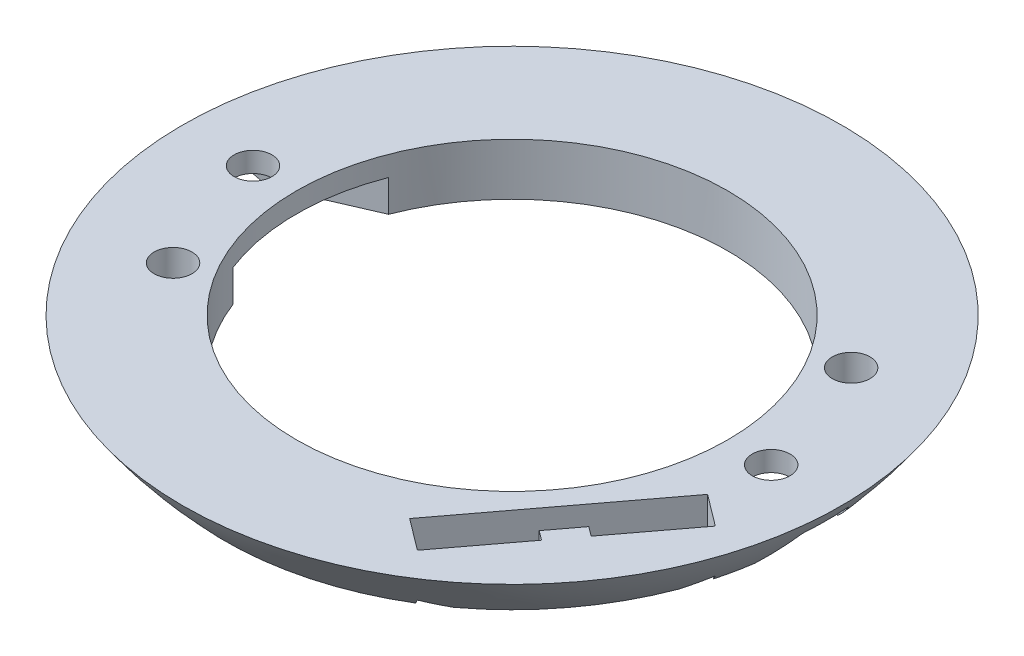
ISO-10303-21;
HEADER;
FILE_DESCRIPTION(('STEP AP214'),'2;1');
FILE_NAME('part.step','',(''),(''),'','','');
FILE_SCHEMA(('AUTOMOTIVE_DESIGN { 1 0 10303 214 1 1 1 1 }'));
ENDSEC;
DATA;
#1=APPLICATION_CONTEXT('core data for automotive mechanical design processes');
#2=APPLICATION_PROTOCOL_DEFINITION('international standard','automotive_design',2000,#1);
#3=PRODUCT_CONTEXT('',#1,'mechanical');
#4=PRODUCT('Part','Part','',(#3));
#5=PRODUCT_RELATED_PRODUCT_CATEGORY('part','',(#4));
#6=PRODUCT_DEFINITION_FORMATION('','',#4);
#7=PRODUCT_DEFINITION_CONTEXT('part definition',#1,'design');
#8=PRODUCT_DEFINITION('design','',#6,#7);
#9=PRODUCT_DEFINITION_SHAPE('','',#8);
#10=(LENGTH_UNIT() NAMED_UNIT(*) SI_UNIT(.MILLI.,.METRE.));
#11=(NAMED_UNIT(*) PLANE_ANGLE_UNIT() SI_UNIT($,.RADIAN.));
#12=(NAMED_UNIT(*) SI_UNIT($,.STERADIAN.) SOLID_ANGLE_UNIT());
#13=UNCERTAINTY_MEASURE_WITH_UNIT(LENGTH_MEASURE(1.E-05),#10,'distance_accuracy_value','');
#14=(GEOMETRIC_REPRESENTATION_CONTEXT(3) GLOBAL_UNCERTAINTY_ASSIGNED_CONTEXT((#13)) GLOBAL_UNIT_ASSIGNED_CONTEXT((#10,
#11,#12)) REPRESENTATION_CONTEXT('',''));
#15=CARTESIAN_POINT('',(0.,0.,0.));
#16=DIRECTION('',(0.,0.,1.));
#17=DIRECTION('',(1.,0.,0.));
#18=AXIS2_PLACEMENT_3D('',#15,#16,#17);
#19=CARTESIAN_POINT('',(0.,0.,0.));
#20=DIRECTION('',(0.,-1.,0.));
#21=DIRECTION('',(-1.,0.,0.));
#22=AXIS2_PLACEMENT_3D('',#19,#20,#21);
#23=SPHERICAL_SURFACE('',#22,33.8);
#24=CARTESIAN_POINT('',(0.,-19.1,0.));
#25=DIRECTION('',(0.,1.,0.));
#26=DIRECTION('',(0.,0.,1.));
#27=AXIS2_PLACEMENT_3D('',#24,#25,#26);
#28=CIRCLE('',#27,27.8860180018589);
#29=CARTESIAN_POINT('',(0.,-19.1,27.8860180018589));
#30=VERTEX_POINT('',#29);
#31=EDGE_CURVE('E258',#30,#30,#28,.F.);
#32=ORIENTED_EDGE('',*,*,#31,.T.);
#33=EDGE_LOOP('',(#32));
#34=FACE_BOUND('',#33,.T.);
#35=CARTESIAN_POINT('',(0.,-23.5,0.));
#36=DIRECTION('',(0.,1.,0.));
#37=DIRECTION('',(-1.,0.,0.));
#38=AXIS2_PLACEMENT_3D('',#35,#36,#37);
#39=CIRCLE('',#38,24.2938263762627);
#40=CARTESIAN_POINT('',(23.4377361695653,-23.5,6.39238009241078));
#41=VERTEX_POINT('',#40);
#42=CARTESIAN_POINT('',(24.0425991799101,-23.5,3.48474169404068));
#43=VERTEX_POINT('',#42);
#44=EDGE_CURVE('E58',#41,#43,#39,.T.);
#45=ORIENTED_EDGE('',*,*,#44,.T.);
#46=CARTESIAN_POINT('',(7.7770088427528,0.,13.1236491606903));
#47=DIRECTION('',(-0.509803921568628,0.,-0.860290626214913));
#48=DIRECTION('',(-0.860290626214914,0.,0.509803921568628));
#49=AXIS2_PLACEMENT_3D('',#46,#47,#48);
#50=CIRCLE('',#49,30.1616970040954);
#51=CARTESIAN_POINT('',(26.5677721433111,-20.8,1.98833682787942));
#52=VERTEX_POINT('',#51);
#53=EDGE_CURVE('E214',#52,#43,#50,.T.);
#54=ORIENTED_EDGE('',*,*,#53,.F.);
#55=CARTESIAN_POINT('',(0.,-20.8,0.));
#56=DIRECTION('',(0.,1.,0.));
#57=DIRECTION('',(0.,0.,1.));
#58=AXIS2_PLACEMENT_3D('',#55,#56,#57);
#59=CIRCLE('',#58,26.6420719914949);
#60=CARTESIAN_POINT('',(26.5677721433111,-20.8,-1.98833682787944));
#61=VERTEX_POINT('',#60);
#62=EDGE_CURVE('E498',#52,#61,#59,.T.);
#63=ORIENTED_EDGE('',*,*,#62,.T.);
#64=CARTESIAN_POINT('',(7.77700884275279,0.,-13.1236491606903));
#65=DIRECTION('',(-0.509803921568628,0.,0.860290626214914));
#66=DIRECTION('',(0.860290626214914,0.,0.509803921568628));
#67=AXIS2_PLACEMENT_3D('',#64,#65,#66);
#68=CIRCLE('',#67,30.1616970040954);
#69=CARTESIAN_POINT('',(24.0425991799101,-23.5,-3.48474169404069));
#70=VERTEX_POINT('',#69);
#71=EDGE_CURVE('E479',#70,#61,#68,.T.);
#72=ORIENTED_EDGE('',*,*,#71,.F.);
#73=CARTESIAN_POINT('',(-24.0425991799101,-23.5,-3.48474169404067));
#74=VERTEX_POINT('',#73);
#75=EDGE_CURVE('E366',#70,#74,#39,.T.);
#76=ORIENTED_EDGE('',*,*,#75,.T.);
#77=CARTESIAN_POINT('',(-7.77700884275279,0.,-13.1236491606903));
#78=DIRECTION('',(0.509803921568628,0.,0.860290626214914));
#79=DIRECTION('',(0.860290626214914,0.,-0.509803921568628));
#80=AXIS2_PLACEMENT_3D('',#77,#78,#79);
#81=CIRCLE('',#80,30.1616970040954);
#82=CARTESIAN_POINT('',(-26.5677721433111,-20.8,-1.98833682787942));
#83=VERTEX_POINT('',#82);
#84=EDGE_CURVE('E50',#83,#74,#81,.T.);
#85=ORIENTED_EDGE('',*,*,#84,.F.);
#86=CARTESIAN_POINT('',(0.,-20.8,0.));
#87=DIRECTION('',(0.,-1.,0.));
#88=DIRECTION('',(0.,0.,-1.));
#89=AXIS2_PLACEMENT_3D('',#86,#87,#88);
#90=CIRCLE('',#89,26.642071991495);
#91=CARTESIAN_POINT('',(-26.5677721433111,-20.8,1.98833682787941));
#92=VERTEX_POINT('',#91);
#93=EDGE_CURVE('E493',#92,#83,#90,.T.);
#94=ORIENTED_EDGE('',*,*,#93,.F.);
#95=CARTESIAN_POINT('',(-7.77700884275278,0.,13.1236491606902));
#96=DIRECTION('',(0.509803921568627,0.,-0.860290626214914));
#97=DIRECTION('',(-0.860290626214914,0.,-0.509803921568627));
#98=AXIS2_PLACEMENT_3D('',#95,#96,#97);
#99=CIRCLE('',#98,30.1616970040954);
#100=CARTESIAN_POINT('',(-24.0425991799101,-23.5,3.48474169404067));
#101=VERTEX_POINT('',#100);
#102=EDGE_CURVE('E480',#101,#92,#99,.T.);
#103=ORIENTED_EDGE('',*,*,#102,.F.);
#104=CARTESIAN_POINT('',(12.6050657528284,-23.5,20.767819273262));
#105=VERTEX_POINT('',#104);
#106=EDGE_CURVE('E368',#101,#105,#39,.T.);
#107=ORIENTED_EDGE('',*,*,#106,.T.);
#108=CARTESIAN_POINT('',(-5.41633520836847,0.,7.18771959042562));
#109=DIRECTION('',(0.601815023152052,0.,-0.79863551004729));
#110=DIRECTION('',(-0.79863551004729,0.,-0.601815023152052));
#111=AXIS2_PLACEMENT_3D('',#108,#109,#110);
#112=CIRCLE('',#111,32.5797483108756);
#113=CARTESIAN_POINT('',(13.2104646358181,-22.7478481812202,21.2240200534666));
#114=VERTEX_POINT('',#113);
#115=EDGE_CURVE('E395',#114,#105,#112,.T.);
#116=ORIENTED_EDGE('',*,*,#115,.F.);
#117=CARTESIAN_POINT('',(18.6267998441866,0.,14.036300463041));
#118=DIRECTION('',(0.79863551004729,0.,0.601815023152052));
#119=DIRECTION('',(0.601815023152052,0.,-0.79863551004729));
#120=AXIS2_PLACEMENT_3D('',#117,#118,#119);
#121=CIRCLE('',#120,24.4635360664775);
#122=CARTESIAN_POINT('',(14.5355819574909,-23.5,19.4655299737013));
#123=VERTEX_POINT('',#122);
#124=EDGE_CURVE('E397',#114,#123,#121,.T.);
#125=ORIENTED_EDGE('',*,*,#124,.T.);
#126=CARTESIAN_POINT('',(0.,-23.5,0.));
#127=DIRECTION('',(0.,1.,0.));
#128=DIRECTION('',(-1.,0.,0.));
#129=AXIS2_PLACEMENT_3D('',#126,#127,#128);
#130=CIRCLE('',#129,24.2938263762627);
#131=CARTESIAN_POINT('',(22.7180177308823,-23.5,8.60707095238078));
#132=VERTEX_POINT('',#131);
#133=EDGE_CURVE('E468',#123,#132,#130,.T.);
#134=ORIENTED_EDGE('',*,*,#133,.T.);
#135=CARTESIAN_POINT('',(18.6267998441866,0.,14.036300463041));
#136=DIRECTION('',(0.79863551004729,0.,0.601815023152052));
#137=DIRECTION('',(0.601815023152052,0.,-0.79863551004729));
#138=AXIS2_PLACEMENT_3D('',#135,#136,#137);
#139=CIRCLE('',#138,24.4635360664775);
#140=CARTESIAN_POINT('',(24.0431350525551,-22.7478481812202,6.84858087261544));
#141=VERTEX_POINT('',#140);
#142=EDGE_CURVE('E391',#132,#141,#139,.T.);
#143=ORIENTED_EDGE('',*,*,#142,.T.);
#144=CARTESIAN_POINT('',(5.4163352083685,0.,-7.18771959042563));
#145=DIRECTION('',(0.601815023152053,0.,-0.798635510047289));
#146=DIRECTION('',(-0.798635510047289,0.,-0.601815023152053));
#147=AXIS2_PLACEMENT_3D('',#144,#145,#146);
#148=CIRCLE('',#147,32.5797483108756);
#149=EDGE_CURVE('E364',#141,#41,#148,.T.);
#150=ORIENTED_EDGE('',*,*,#149,.T.);
#151=EDGE_LOOP('',(#45,#54,#63,#72,#76,#85,#94,#103,#107,#116,#125,#134,#143,#150));
#152=FACE_BOUND('',#151,.T.);
#153=ADVANCED_FACE('F36',(#34,#152),#23,.T.);
#154=CARTESIAN_POINT('',(0.,-23.5,0.));
#155=DIRECTION('',(0.,1.,0.));
#156=DIRECTION('',(-1.,0.,0.));
#157=AXIS2_PLACEMENT_3D('',#154,#155,#156);
#158=PLANE('',#157);
#159=CARTESIAN_POINT('',(-18.1865334794732,-23.5,10.5));
#160=DIRECTION('',(0.,1.,0.));
#161=DIRECTION('',(-1.,0.,0.));
#162=AXIS2_PLACEMENT_3D('',#159,#160,#161);
#163=CIRCLE('',#162,1.6);
#164=CARTESIAN_POINT('',(-19.7865334794732,-23.5,10.5));
#165=VERTEX_POINT('',#164);
#166=EDGE_CURVE('E458',#165,#165,#163,.T.);
#167=ORIENTED_EDGE('',*,*,#166,.T.);
#168=EDGE_LOOP('',(#167));
#169=FACE_BOUND('',#168,.T.);
#170=DIRECTION('',(0.860290626214914,0.,-0.509803921568628));
#171=VECTOR('',#170,1.);
#172=CARTESIAN_POINT('',(29.9230769230769,-23.5,0.));
#173=LINE('',#172,#171);
#174=CARTESIAN_POINT('',(24.,-23.5,3.50998575495684));
#175=VERTEX_POINT('',#174);
#176=EDGE_CURVE('E206',#175,#43,#173,.T.);
#177=ORIENTED_EDGE('',*,*,#176,.T.);
#178=ORIENTED_EDGE('',*,*,#44,.F.);
#179=DIRECTION('',(-0.798635510047289,0.,-0.601815023152053));
#180=VECTOR('',#179,1.);
#181=CARTESIAN_POINT('',(5.41633520836849,-23.5,-7.18771959042564));
#182=LINE('',#181,#180);
#183=CARTESIAN_POINT('',(21.3890454093143,-23.5,4.84858087261543));
#184=VERTEX_POINT('',#183);
#185=EDGE_CURVE('E387',#41,#184,#182,.T.);
#186=ORIENTED_EDGE('',*,*,#185,.T.);
#187=DIRECTION('',(0.601815023152052,0.,-0.79863551004729));
#188=VECTOR('',#187,1.);
#189=CARTESIAN_POINT('',(15.9727102009458,-23.5,12.0363004630411));
#190=LINE('',#189,#188);
#191=CARTESIAN_POINT('',(10.5563749925773,-23.5,19.2240200534667));
#192=VERTEX_POINT('',#191);
#193=EDGE_CURVE('E381',#192,#184,#190,.T.);
#194=ORIENTED_EDGE('',*,*,#193,.F.);
#195=DIRECTION('',(-0.79863551004729,0.,-0.601815023152052));
#196=VECTOR('',#195,1.);
#197=CARTESIAN_POINT('',(-5.41633520836848,-23.5,7.18771959042561));
#198=LINE('',#197,#196);
#199=EDGE_CURVE('E375',#105,#192,#198,.T.);
#200=ORIENTED_EDGE('',*,*,#199,.F.);
#201=ORIENTED_EDGE('',*,*,#106,.F.);
#202=DIRECTION('',(0.860290626214914,0.,0.509803921568627));
#203=VECTOR('',#202,1.);
#204=CARTESIAN_POINT('',(-29.9230769230769,-23.5,0.));
#205=LINE('',#204,#203);
#206=CARTESIAN_POINT('',(-24.,-23.5,3.50998575495685));
#207=VERTEX_POINT('',#206);
#208=EDGE_CURVE('E485',#101,#207,#205,.T.);
#209=ORIENTED_EDGE('',*,*,#208,.T.);
#210=CARTESIAN_POINT('',(-21.92,-23.5,0.));
#211=DIRECTION('',(0.,-1.,0.));
#212=DIRECTION('',(1.,0.,0.));
#213=AXIS2_PLACEMENT_3D('',#210,#211,#212);
#214=CIRCLE('',#213,4.08);
#215=CARTESIAN_POINT('',(-23.5442836718279,-23.5,3.74273997940457));
#216=VERTEX_POINT('',#215);
#217=EDGE_CURVE('E289',#207,#216,#214,.F.);
#218=ORIENTED_EDGE('',*,*,#217,.T.);
#219=DIRECTION('',(0.917338230246221,0.,0.398108743095064));
#220=VECTOR('',#219,1.);
#221=CARTESIAN_POINT('',(-5.09839699535364,-23.5,11.7479320862179));
#222=LINE('',#221,#220);
#223=CARTESIAN_POINT('',(-17.0257322293628,-23.5,6.57167726338076));
#224=VERTEX_POINT('',#223);
#225=EDGE_CURVE('E225',#216,#224,#222,.T.);
#226=ORIENTED_EDGE('',*,*,#225,.T.);
#227=CARTESIAN_POINT('',(0.,-23.5,0.));
#228=DIRECTION('',(0.,-1.,0.));
#229=DIRECTION('',(1.,0.,0.));
#230=AXIS2_PLACEMENT_3D('',#227,#228,#229);
#231=CIRCLE('',#230,18.25);
#232=CARTESIAN_POINT('',(17.0257322293628,-23.5,6.57167726338076));
#233=VERTEX_POINT('',#232);
#234=EDGE_CURVE('E39',#224,#233,#231,.F.);
#235=ORIENTED_EDGE('',*,*,#234,.T.);
#236=DIRECTION('',(-0.917338230246221,0.,0.398108743095064));
#237=VECTOR('',#236,1.);
#238=CARTESIAN_POINT('',(5.09839699535366,-23.5,11.7479320862179));
#239=LINE('',#238,#237);
#240=CARTESIAN_POINT('',(23.5442836718279,-23.5,3.74273997940458));
#241=VERTEX_POINT('',#240);
#242=EDGE_CURVE('E221',#241,#233,#239,.T.);
#243=ORIENTED_EDGE('',*,*,#242,.F.);
#244=CARTESIAN_POINT('',(21.92,-23.5,0.));
#245=DIRECTION('',(0.,-1.,0.));
#246=DIRECTION('',(1.,0.,0.));
#247=AXIS2_PLACEMENT_3D('',#244,#245,#246);
#248=CIRCLE('',#247,4.08);
#249=EDGE_CURVE('E218',#241,#175,#248,.F.);
#250=ORIENTED_EDGE('',*,*,#249,.T.);
#251=EDGE_LOOP('',(#177,#178,#186,#194,#200,#201,#209,#218,#226,#235,#243,#250));
#252=FACE_BOUND('',#251,.T.);
#253=ADVANCED_FACE('F219',(#169,#252),#158,.F.);
#254=CARTESIAN_POINT('',(18.1865334794732,-23.5,-10.5));
#255=DIRECTION('',(0.,1.,0.));
#256=DIRECTION('',(-1.,0.,0.));
#257=AXIS2_PLACEMENT_3D('',#254,#255,#256);
#258=CIRCLE('',#257,1.6);
#259=CARTESIAN_POINT('',(16.5865334794732,-23.5,-10.5));
#260=VERTEX_POINT('',#259);
#261=EDGE_CURVE('E456',#260,#260,#258,.T.);
#262=ORIENTED_EDGE('',*,*,#261,.T.);
#263=EDGE_LOOP('',(#262));
#264=FACE_BOUND('',#263,.T.);
#265=DIRECTION('',(-0.860290626214914,0.,-0.509803921568628));
#266=VECTOR('',#265,1.);
#267=CARTESIAN_POINT('',(24.,-23.5,-3.50998575495685));
#268=LINE('',#267,#266);
#269=CARTESIAN_POINT('',(24.,-23.5,-3.50998575495685));
#270=VERTEX_POINT('',#269);
#271=EDGE_CURVE('E477',#70,#270,#268,.T.);
#272=ORIENTED_EDGE('',*,*,#271,.T.);
#273=CARTESIAN_POINT('',(21.92,-23.5,0.));
#274=DIRECTION('',(0.,-1.,0.));
#275=DIRECTION('',(1.,0.,0.));
#276=AXIS2_PLACEMENT_3D('',#273,#274,#275);
#277=CIRCLE('',#276,4.08);
#278=CARTESIAN_POINT('',(23.5442836718279,-23.5,-3.74273997940459));
#279=VERTEX_POINT('',#278);
#280=EDGE_CURVE('E224',#270,#279,#277,.F.);
#281=ORIENTED_EDGE('',*,*,#280,.T.);
#282=DIRECTION('',(0.917338230246221,0.,0.398108743095064));
#283=VECTOR('',#282,1.);
#284=CARTESIAN_POINT('',(5.09839699535366,-23.5,-11.7479320862179));
#285=LINE('',#284,#283);
#286=CARTESIAN_POINT('',(17.0257322293628,-23.5,-6.57167726338077));
#287=VERTEX_POINT('',#286);
#288=EDGE_CURVE('E286',#287,#279,#285,.T.);
#289=ORIENTED_EDGE('',*,*,#288,.F.);
#290=CARTESIAN_POINT('',(-17.0257322293628,-23.5,-6.57167726338077));
#291=VERTEX_POINT('',#290);
#292=EDGE_CURVE('E11',#287,#291,#231,.F.);
#293=ORIENTED_EDGE('',*,*,#292,.T.);
#294=DIRECTION('',(0.917338230246221,0.,-0.398108743095064));
#295=VECTOR('',#294,1.);
#296=CARTESIAN_POINT('',(-5.09839699535364,-23.5,-11.7479320862179));
#297=LINE('',#296,#295);
#298=CARTESIAN_POINT('',(-23.5442836718279,-23.5,-3.74273997940457));
#299=VERTEX_POINT('',#298);
#300=EDGE_CURVE('E291',#299,#291,#297,.T.);
#301=ORIENTED_EDGE('',*,*,#300,.F.);
#302=CARTESIAN_POINT('',(-21.92,-23.5,0.));
#303=DIRECTION('',(0.,-1.,0.));
#304=DIRECTION('',(1.,0.,0.));
#305=AXIS2_PLACEMENT_3D('',#302,#303,#304);
#306=CIRCLE('',#305,4.08);
#307=CARTESIAN_POINT('',(-24.,-23.5,-3.50998575495685));
#308=VERTEX_POINT('',#307);
#309=EDGE_CURVE('E294',#299,#308,#306,.F.);
#310=ORIENTED_EDGE('',*,*,#309,.T.);
#311=DIRECTION('',(-0.860290626214914,0.,0.509803921568628));
#312=VECTOR('',#311,1.);
#313=CARTESIAN_POINT('',(-24.,-23.5,-3.50998575495685));
#314=LINE('',#313,#312);
#315=EDGE_CURVE('E483',#308,#74,#314,.T.);
#316=ORIENTED_EDGE('',*,*,#315,.T.);
#317=ORIENTED_EDGE('',*,*,#75,.F.);
#318=EDGE_LOOP('',(#272,#281,#289,#293,#301,#310,#316,#317));
#319=FACE_BOUND('',#318,.T.);
#320=ADVANCED_FACE('F357',(#264,#319),#158,.F.);
#321=CARTESIAN_POINT('',(-5.09839699535365,-33.801,11.7479320862179));
#322=DIRECTION('',(-0.398108743095063,0.,0.917338230246221));
#323=DIRECTION('',(0.917338230246221,0.,0.398108743095064));
#324=AXIS2_PLACEMENT_3D('',#321,#322,#323);
#325=PLANE('',#324);
#326=ORIENTED_EDGE('',*,*,#225,.F.);
#327=DIRECTION('',(0.,1.,0.));
#328=VECTOR('',#327,1.);
#329=CARTESIAN_POINT('',(-23.5442836718279,-33.801,3.74273997940457));
#330=LINE('',#329,#328);
#331=CARTESIAN_POINT('',(-23.5442836718279,-20.8,3.74273997940457));
#332=VERTEX_POINT('',#331);
#333=EDGE_CURVE('E253',#216,#332,#330,.T.);
#334=ORIENTED_EDGE('',*,*,#333,.T.);
#335=DIRECTION('',(0.917338230246221,0.,0.398108743095064));
#336=VECTOR('',#335,1.);
#337=CARTESIAN_POINT('',(-23.5442836718279,-20.8,3.74273997940457));
#338=LINE('',#337,#336);
#339=CARTESIAN_POINT('',(-17.0257322293628,-20.8,6.57167726338076));
#340=VERTEX_POINT('',#339);
#341=EDGE_CURVE('E305',#332,#340,#338,.T.);
#342=ORIENTED_EDGE('',*,*,#341,.T.);
#343=DIRECTION('',(0.,1.,0.));
#344=VECTOR('',#343,1.);
#345=CARTESIAN_POINT('',(-17.0257322293628,-33.801,6.57167726338076));
#346=LINE('',#345,#344);
#347=EDGE_CURVE('E255',#224,#340,#346,.T.);
#348=ORIENTED_EDGE('',*,*,#347,.F.);
#349=EDGE_LOOP('',(#326,#334,#342,#348));
#350=FACE_BOUND('',#349,.T.);
#351=ADVANCED_FACE('F530',(#350),#325,.F.);
#352=CARTESIAN_POINT('',(-21.92,-33.801,0.));
#353=DIRECTION('',(0.,1.,0.));
#354=DIRECTION('',(0.,0.,1.));
#355=AXIS2_PLACEMENT_3D('',#352,#353,#354);
#356=CYLINDRICAL_SURFACE('',#355,4.08);
#357=ORIENTED_EDGE('',*,*,#217,.F.);
#358=DIRECTION('',(0.,1.,0.));
#359=VECTOR('',#358,1.);
#360=CARTESIAN_POINT('',(-24.,-33.801,3.50998575495685));
#361=LINE('',#360,#359);
#362=CARTESIAN_POINT('',(-24.,-20.8,3.50998575495685));
#363=VERTEX_POINT('',#362);
#364=EDGE_CURVE('E250',#207,#363,#361,.T.);
#365=ORIENTED_EDGE('',*,*,#364,.T.);
#366=CARTESIAN_POINT('',(-21.92,-20.8,0.));
#367=DIRECTION('',(0.,1.,0.));
#368=DIRECTION('',(0.,0.,1.));
#369=AXIS2_PLACEMENT_3D('',#366,#367,#368);
#370=CIRCLE('',#369,4.08);
#371=EDGE_CURVE('E312',#363,#332,#370,.T.);
#372=ORIENTED_EDGE('',*,*,#371,.T.);
#373=ORIENTED_EDGE('',*,*,#333,.F.);
#374=EDGE_LOOP('',(#357,#365,#372,#373));
#375=FACE_BOUND('',#374,.T.);
#376=ADVANCED_FACE('F528',(#375),#356,.F.);
#377=CARTESIAN_POINT('',(-21.92,-33.801,0.));
#378=DIRECTION('',(0.,1.,0.));
#379=DIRECTION('',(0.,0.,1.));
#380=AXIS2_PLACEMENT_3D('',#377,#378,#379);
#381=CYLINDRICAL_SURFACE('',#380,4.08);
#382=ORIENTED_EDGE('',*,*,#309,.F.);
#383=DIRECTION('',(0.,1.,0.));
#384=VECTOR('',#383,1.);
#385=CARTESIAN_POINT('',(-23.5442836718279,-33.801,-3.74273997940457));
#386=LINE('',#385,#384);
#387=CARTESIAN_POINT('',(-23.5442836718279,-20.8,-3.74273997940457));
#388=VERTEX_POINT('',#387);
#389=EDGE_CURVE('E246',#299,#388,#386,.T.);
#390=ORIENTED_EDGE('',*,*,#389,.T.);
#391=CARTESIAN_POINT('',(-21.92,-20.8,0.));
#392=DIRECTION('',(0.,1.,0.));
#393=DIRECTION('',(0.,0.,1.));
#394=AXIS2_PLACEMENT_3D('',#391,#392,#393);
#395=CIRCLE('',#394,4.08);
#396=CARTESIAN_POINT('',(-24.,-20.8,-3.50998575495685));
#397=VERTEX_POINT('',#396);
#398=EDGE_CURVE('E315',#388,#397,#395,.T.);
#399=ORIENTED_EDGE('',*,*,#398,.T.);
#400=DIRECTION('',(0.,1.,0.));
#401=VECTOR('',#400,1.);
#402=CARTESIAN_POINT('',(-24.,-33.801,-3.50998575495685));
#403=LINE('',#402,#401);
#404=EDGE_CURVE('E248',#308,#397,#403,.T.);
#405=ORIENTED_EDGE('',*,*,#404,.F.);
#406=EDGE_LOOP('',(#382,#390,#399,#405));
#407=FACE_BOUND('',#406,.T.);
#408=ADVANCED_FACE('F540',(#407),#381,.F.);
#409=CARTESIAN_POINT('',(-5.09839699535365,-33.801,-11.7479320862179));
#410=DIRECTION('',(0.398108743095063,0.,0.917338230246221));
#411=DIRECTION('',(0.917338230246221,0.,-0.398108743095064));
#412=AXIS2_PLACEMENT_3D('',#409,#410,#411);
#413=PLANE('',#412);
#414=ORIENTED_EDGE('',*,*,#389,.F.);
#415=ORIENTED_EDGE('',*,*,#300,.T.);
#416=DIRECTION('',(0.,1.,0.));
#417=VECTOR('',#416,1.);
#418=CARTESIAN_POINT('',(-17.0257322293628,-33.801,-6.57167726338077));
#419=LINE('',#418,#417);
#420=CARTESIAN_POINT('',(-17.0257322293628,-20.8,-6.57167726338077));
#421=VERTEX_POINT('',#420);
#422=EDGE_CURVE('E244',#291,#421,#419,.T.);
#423=ORIENTED_EDGE('',*,*,#422,.T.);
#424=DIRECTION('',(-0.917338230246221,0.,0.398108743095064));
#425=VECTOR('',#424,1.);
#426=CARTESIAN_POINT('',(-23.5442836718279,-20.8,-3.74273997940457));
#427=LINE('',#426,#425);
#428=EDGE_CURVE('E318',#421,#388,#427,.T.);
#429=ORIENTED_EDGE('',*,*,#428,.T.);
#430=EDGE_LOOP('',(#414,#415,#423,#429));
#431=FACE_BOUND('',#430,.T.);
#432=ADVANCED_FACE('F536',(#431),#413,.T.);
#433=CARTESIAN_POINT('',(5.09839699535365,-33.801,11.7479320862179));
#434=DIRECTION('',(-0.398108743095064,0.,-0.917338230246221));
#435=DIRECTION('',(-0.917338230246221,0.,0.398108743095064));
#436=AXIS2_PLACEMENT_3D('',#433,#434,#435);
#437=PLANE('',#436);
#438=DIRECTION('',(0.,1.,0.));
#439=VECTOR('',#438,1.);
#440=CARTESIAN_POINT('',(23.5442836718279,-33.801,3.74273997940457));
#441=LINE('',#440,#439);
#442=CARTESIAN_POINT('',(23.5442836718279,-20.8,3.74273997940457));
#443=VERTEX_POINT('',#442);
#444=EDGE_CURVE('E232',#241,#443,#441,.T.);
#445=ORIENTED_EDGE('',*,*,#444,.F.);
#446=ORIENTED_EDGE('',*,*,#242,.T.);
#447=DIRECTION('',(0.,1.,0.));
#448=VECTOR('',#447,1.);
#449=CARTESIAN_POINT('',(17.0257322293628,-33.801,6.57167726338076));
#450=LINE('',#449,#448);
#451=CARTESIAN_POINT('',(17.0257322293628,-20.8,6.57167726338076));
#452=VERTEX_POINT('',#451);
#453=EDGE_CURVE('E257',#233,#452,#450,.T.);
#454=ORIENTED_EDGE('',*,*,#453,.T.);
#455=DIRECTION('',(0.917338230246221,0.,-0.398108743095064));
#456=VECTOR('',#455,1.);
#457=CARTESIAN_POINT('',(23.5442836718279,-20.8,3.74273997940457));
#458=LINE('',#457,#456);
#459=EDGE_CURVE('E325',#452,#443,#458,.T.);
#460=ORIENTED_EDGE('',*,*,#459,.T.);
#461=EDGE_LOOP('',(#445,#446,#454,#460));
#462=FACE_BOUND('',#461,.T.);
#463=ADVANCED_FACE('F275',(#462),#437,.T.);
#464=CARTESIAN_POINT('',(5.09839699535365,-33.801,-11.7479320862179));
#465=DIRECTION('',(-0.398108743095064,0.,0.917338230246221));
#466=DIRECTION('',(0.917338230246221,0.,0.398108743095064));
#467=AXIS2_PLACEMENT_3D('',#464,#465,#466);
#468=PLANE('',#467);
#469=DIRECTION('',(0.,1.,0.));
#470=VECTOR('',#469,1.);
#471=CARTESIAN_POINT('',(17.0257322293628,-33.801,-6.57167726338076));
#472=LINE('',#471,#470);
#473=CARTESIAN_POINT('',(17.0257322293628,-20.8,-6.57167726338076));
#474=VERTEX_POINT('',#473);
#475=EDGE_CURVE('E242',#287,#474,#472,.T.);
#476=ORIENTED_EDGE('',*,*,#475,.F.);
#477=ORIENTED_EDGE('',*,*,#288,.T.);
#478=DIRECTION('',(0.,1.,0.));
#479=VECTOR('',#478,1.);
#480=CARTESIAN_POINT('',(23.5442836718279,-33.801,-3.74273997940458));
#481=LINE('',#480,#479);
#482=CARTESIAN_POINT('',(23.5442836718279,-20.8,-3.74273997940458));
#483=VERTEX_POINT('',#482);
#484=EDGE_CURVE('E235',#279,#483,#481,.T.);
#485=ORIENTED_EDGE('',*,*,#484,.T.);
#486=DIRECTION('',(-0.917338230246221,0.,-0.398108743095062));
#487=VECTOR('',#486,1.);
#488=CARTESIAN_POINT('',(17.0257322293628,-20.8,-6.57167726338076));
#489=LINE('',#488,#487);
#490=EDGE_CURVE('E331',#483,#474,#489,.T.);
#491=ORIENTED_EDGE('',*,*,#490,.T.);
#492=EDGE_LOOP('',(#476,#477,#485,#491));
#493=FACE_BOUND('',#492,.T.);
#494=ADVANCED_FACE('F599',(#493),#468,.T.);
#495=CARTESIAN_POINT('',(21.92,-33.801,0.));
#496=DIRECTION('',(0.,1.,0.));
#497=DIRECTION('',(0.,0.,1.));
#498=AXIS2_PLACEMENT_3D('',#495,#496,#497);
#499=CYLINDRICAL_SURFACE('',#498,4.08);
#500=ORIENTED_EDGE('',*,*,#280,.F.);
#501=DIRECTION('',(0.,1.,0.));
#502=VECTOR('',#501,1.);
#503=CARTESIAN_POINT('',(24.,-33.801,-3.50998575495685));
#504=LINE('',#503,#502);
#505=CARTESIAN_POINT('',(24.,-20.8,-3.50998575495685));
#506=VERTEX_POINT('',#505);
#507=EDGE_CURVE('E231',#270,#506,#504,.T.);
#508=ORIENTED_EDGE('',*,*,#507,.T.);
#509=CARTESIAN_POINT('',(21.92,-20.8,0.));
#510=DIRECTION('',(0.,1.,0.));
#511=DIRECTION('',(0.,0.,1.));
#512=AXIS2_PLACEMENT_3D('',#509,#510,#511);
#513=CIRCLE('',#512,4.07999999999999);
#514=EDGE_CURVE('E328',#506,#483,#513,.T.);
#515=ORIENTED_EDGE('',*,*,#514,.T.);
#516=ORIENTED_EDGE('',*,*,#484,.F.);
#517=EDGE_LOOP('',(#500,#508,#515,#516));
#518=FACE_BOUND('',#517,.T.);
#519=ADVANCED_FACE('F515',(#518),#499,.F.);
#520=CARTESIAN_POINT('',(21.92,-33.801,0.));
#521=DIRECTION('',(0.,1.,0.));
#522=DIRECTION('',(0.,0.,1.));
#523=AXIS2_PLACEMENT_3D('',#520,#521,#522);
#524=CYLINDRICAL_SURFACE('',#523,4.08);
#525=ORIENTED_EDGE('',*,*,#249,.F.);
#526=ORIENTED_EDGE('',*,*,#444,.T.);
#527=CARTESIAN_POINT('',(21.92,-20.8,0.));
#528=DIRECTION('',(0.,1.,0.));
#529=DIRECTION('',(0.,0.,1.));
#530=AXIS2_PLACEMENT_3D('',#527,#528,#529);
#531=CIRCLE('',#530,4.08);
#532=CARTESIAN_POINT('',(24.,-20.8,3.50998575495684));
#533=VERTEX_POINT('',#532);
#534=EDGE_CURVE('E230',#443,#533,#531,.T.);
#535=ORIENTED_EDGE('',*,*,#534,.T.);
#536=DIRECTION('',(0.,1.,0.));
#537=VECTOR('',#536,1.);
#538=CARTESIAN_POINT('',(24.,-33.801,3.50998575495684));
#539=LINE('',#538,#537);
#540=EDGE_CURVE('E211',#175,#533,#539,.T.);
#541=ORIENTED_EDGE('',*,*,#540,.F.);
#542=EDGE_LOOP('',(#525,#526,#535,#541));
#543=FACE_BOUND('',#542,.T.);
#544=ADVANCED_FACE('F228',(#543),#524,.F.);
#545=CARTESIAN_POINT('',(0.,-33.801,0.));
#546=DIRECTION('',(0.,1.,0.));
#547=DIRECTION('',(0.,0.,1.));
#548=AXIS2_PLACEMENT_3D('',#545,#546,#547);
#549=CYLINDRICAL_SURFACE('',#548,18.25);
#550=CARTESIAN_POINT('',(0.,-19.1,0.));
#551=DIRECTION('',(0.,1.,0.));
#552=DIRECTION('',(0.,0.,1.));
#553=AXIS2_PLACEMENT_3D('',#550,#551,#552);
#554=CIRCLE('',#553,18.25);
#555=CARTESIAN_POINT('',(0.,-19.1,18.25));
#556=VERTEX_POINT('',#555);
#557=EDGE_CURVE('E237',#556,#556,#554,.T.);
#558=ORIENTED_EDGE('',*,*,#557,.T.);
#559=EDGE_LOOP('',(#558));
#560=FACE_BOUND('',#559,.T.);
#561=ORIENTED_EDGE('',*,*,#292,.F.);
#562=ORIENTED_EDGE('',*,*,#475,.T.);
#563=CARTESIAN_POINT('',(0.,-20.8,0.));
#564=DIRECTION('',(0.,-1.,0.));
#565=DIRECTION('',(0.,0.,1.));
#566=AXIS2_PLACEMENT_3D('',#563,#564,#565);
#567=CIRCLE('',#566,18.25);
#568=EDGE_CURVE('E271',#474,#452,#567,.T.);
#569=ORIENTED_EDGE('',*,*,#568,.T.);
#570=ORIENTED_EDGE('',*,*,#453,.F.);
#571=ORIENTED_EDGE('',*,*,#234,.F.);
#572=ORIENTED_EDGE('',*,*,#347,.T.);
#573=CARTESIAN_POINT('',(0.,-20.8,0.));
#574=DIRECTION('',(0.,-1.,0.));
#575=DIRECTION('',(0.,0.,1.));
#576=AXIS2_PLACEMENT_3D('',#573,#574,#575);
#577=CIRCLE('',#576,18.25);
#578=EDGE_CURVE('E321',#340,#421,#577,.T.);
#579=ORIENTED_EDGE('',*,*,#578,.T.);
#580=ORIENTED_EDGE('',*,*,#422,.F.);
#581=EDGE_LOOP('',(#561,#562,#569,#570,#571,#572,#579,#580));
#582=FACE_BOUND('',#581,.T.);
#583=ADVANCED_FACE('F269',(#560,#582),#549,.F.);
#584=CARTESIAN_POINT('',(0.,-19.1,0.));
#585=DIRECTION('',(0.,1.,0.));
#586=DIRECTION('',(0.,0.,1.));
#587=AXIS2_PLACEMENT_3D('',#584,#585,#586);
#588=PLANE('',#587);
#589=CARTESIAN_POINT('',(-18.1865334794732,-19.1,10.5));
#590=DIRECTION('',(0.,1.,0.));
#591=DIRECTION('',(0.,0.,1.));
#592=AXIS2_PLACEMENT_3D('',#589,#590,#591);
#593=CIRCLE('',#592,1.6);
#594=CARTESIAN_POINT('',(-18.1865334794732,-19.1,12.1));
#595=VERTEX_POINT('',#594);
#596=EDGE_CURVE('E370',#595,#595,#593,.T.);
#597=ORIENTED_EDGE('',*,*,#596,.F.);
#598=EDGE_LOOP('',(#597));
#599=FACE_BOUND('',#598,.T.);
#600=CARTESIAN_POINT('',(18.1865334794732,-19.1,-10.5));
#601=DIRECTION('',(0.,1.,0.));
#602=DIRECTION('',(0.,0.,1.));
#603=AXIS2_PLACEMENT_3D('',#600,#601,#602);
#604=CIRCLE('',#603,1.6);
#605=CARTESIAN_POINT('',(18.1865334794732,-19.1,-8.89999999999996));
#606=VERTEX_POINT('',#605);
#607=EDGE_CURVE('E365',#606,#606,#604,.T.);
#608=ORIENTED_EDGE('',*,*,#607,.F.);
#609=EDGE_LOOP('',(#608));
#610=FACE_BOUND('',#609,.T.);
#611=DIRECTION('',(0.601815023152053,0.,-0.798635510047289));
#612=VECTOR('',#611,1.);
#613=CARTESIAN_POINT('',(17.8281643341393,-19.1,13.434485439889));
#614=LINE('',#613,#612);
#615=CARTESIAN_POINT('',(16.9254417994112,-19.1,14.6324387049599));
#616=VERTEX_POINT('',#615);
#617=CARTESIAN_POINT('',(18.7308868688674,-19.1,12.236532174818));
#618=VERTEX_POINT('',#617);
#619=EDGE_CURVE('E400',#616,#618,#614,.T.);
#620=ORIENTED_EDGE('',*,*,#619,.F.);
#621=DIRECTION('',(0.798635510047288,0.,0.601815023152056));
#622=VECTOR('',#621,1.);
#623=CARTESIAN_POINT('',(-0.902722534728022,-19.1,1.19795326507085));
#624=LINE('',#623,#622);
#625=CARTESIAN_POINT('',(17.7240773094585,-19.1,15.234253728112));
#626=VERTEX_POINT('',#625);
#627=EDGE_CURVE('E419',#616,#626,#624,.T.);
#628=ORIENTED_EDGE('',*,*,#627,.T.);
#629=DIRECTION('',(0.601815023152052,0.,-0.79863551004729));
#630=VECTOR('',#629,1.);
#631=CARTESIAN_POINT('',(18.6267998441866,-19.1,14.036300463041));
#632=LINE('',#631,#630);
#633=CARTESIAN_POINT('',(13.2104646358181,-19.1,21.2240200534666));
#634=VERTEX_POINT('',#633);
#635=EDGE_CURVE('E410',#634,#626,#632,.T.);
#636=ORIENTED_EDGE('',*,*,#635,.F.);
#637=DIRECTION('',(-0.79863551004729,0.,-0.601815023152052));
#638=VECTOR('',#637,1.);
#639=CARTESIAN_POINT('',(-5.41633520836847,-19.1,7.18771959042562));
#640=LINE('',#639,#638);
#641=CARTESIAN_POINT('',(10.5563749925773,-19.1,19.2240200534667));
#642=VERTEX_POINT('',#641);
#643=EDGE_CURVE('E416',#634,#642,#640,.T.);
#644=ORIENTED_EDGE('',*,*,#643,.T.);
#645=DIRECTION('',(0.601815023152052,0.,-0.79863551004729));
#646=VECTOR('',#645,1.);
#647=CARTESIAN_POINT('',(15.9727102009458,-19.1,12.036300463041));
#648=LINE('',#647,#646);
#649=CARTESIAN_POINT('',(21.3890454093143,-19.1,4.84858087261543));
#650=VERTEX_POINT('',#649);
#651=EDGE_CURVE('E413',#642,#650,#648,.T.);
#652=ORIENTED_EDGE('',*,*,#651,.T.);
#653=DIRECTION('',(-0.798635510047289,0.,-0.601815023152053));
#654=VECTOR('',#653,1.);
#655=CARTESIAN_POINT('',(5.4163352083685,-19.1,-7.18771959042563));
#656=LINE('',#655,#654);
#657=CARTESIAN_POINT('',(24.0431350525551,-19.1,6.84858087261543));
#658=VERTEX_POINT('',#657);
#659=EDGE_CURVE('E409',#658,#650,#656,.T.);
#660=ORIENTED_EDGE('',*,*,#659,.F.);
#661=CARTESIAN_POINT('',(19.5295223789147,-19.1,12.8383471979701));
#662=VERTEX_POINT('',#661);
#663=EDGE_CURVE('E406',#662,#658,#632,.T.);
#664=ORIENTED_EDGE('',*,*,#663,.F.);
#665=DIRECTION('',(0.798635510047289,0.,0.601815023152053));
#666=VECTOR('',#665,1.);
#667=CARTESIAN_POINT('',(0.902722534728095,-19.1,-1.19795326507095));
#668=LINE('',#667,#666);
#669=EDGE_CURVE('E403',#618,#662,#668,.T.);
#670=ORIENTED_EDGE('',*,*,#669,.F.);
#671=EDGE_LOOP('',(#620,#628,#636,#644,#652,#660,#664,#670));
#672=FACE_BOUND('',#671,.T.);
#673=CARTESIAN_POINT('',(-21.92,-19.1,0.));
#674=DIRECTION('',(0.,1.,0.));
#675=DIRECTION('',(0.,0.,1.));
#676=AXIS2_PLACEMENT_3D('',#673,#674,#675);
#677=CIRCLE('',#676,1.6);
#678=CARTESIAN_POINT('',(-21.92,-19.1,1.6));
#679=VERTEX_POINT('',#678);
#680=EDGE_CURVE('E301',#679,#679,#677,.T.);
#681=ORIENTED_EDGE('',*,*,#680,.F.);
#682=EDGE_LOOP('',(#681));
#683=FACE_BOUND('',#682,.T.);
#684=CARTESIAN_POINT('',(21.92,-19.1,0.));
#685=DIRECTION('',(0.,1.,0.));
#686=DIRECTION('',(0.,0.,1.));
#687=AXIS2_PLACEMENT_3D('',#684,#685,#686);
#688=CIRCLE('',#687,1.6);
#689=CARTESIAN_POINT('',(21.92,-19.1,1.59999999999999));
#690=VERTEX_POINT('',#689);
#691=EDGE_CURVE('E297',#690,#690,#688,.T.);
#692=ORIENTED_EDGE('',*,*,#691,.F.);
#693=EDGE_LOOP('',(#692));
#694=FACE_BOUND('',#693,.T.);
#695=ORIENTED_EDGE('',*,*,#557,.F.);
#696=EDGE_LOOP('',(#695));
#697=FACE_BOUND('',#696,.T.);
#698=ORIENTED_EDGE('',*,*,#31,.F.);
#699=EDGE_LOOP('',(#698));
#700=FACE_BOUND('',#699,.T.);
#701=ADVANCED_FACE('F337',(#599,#610,#672,#683,#694,#697,#700),#588,.T.);
#702=CARTESIAN_POINT('',(0.,-20.8,0.));
#703=DIRECTION('',(0.,1.,0.));
#704=DIRECTION('',(0.,0.,1.));
#705=AXIS2_PLACEMENT_3D('',#702,#703,#704);
#706=PLANE('',#705);
#707=CARTESIAN_POINT('',(21.92,-20.8,0.));
#708=DIRECTION('',(0.,1.,0.));
#709=DIRECTION('',(0.,0.,1.));
#710=AXIS2_PLACEMENT_3D('',#707,#708,#709);
#711=CIRCLE('',#710,1.6);
#712=CARTESIAN_POINT('',(21.92,-20.8,1.59999999999999));
#713=VERTEX_POINT('',#712);
#714=EDGE_CURVE('E302',#713,#713,#711,.T.);
#715=ORIENTED_EDGE('',*,*,#714,.T.);
#716=EDGE_LOOP('',(#715));
#717=FACE_BOUND('',#716,.T.);
#718=ORIENTED_EDGE('',*,*,#568,.F.);
#719=ORIENTED_EDGE('',*,*,#490,.F.);
#720=ORIENTED_EDGE('',*,*,#514,.F.);
#721=DIRECTION('',(0.860290626214914,0.,0.509803921568628));
#722=VECTOR('',#721,1.);
#723=CARTESIAN_POINT('',(24.,-20.8,-3.50998575495685));
#724=LINE('',#723,#722);
#725=EDGE_CURVE('E500',#506,#61,#724,.T.);
#726=ORIENTED_EDGE('',*,*,#725,.T.);
#727=ORIENTED_EDGE('',*,*,#62,.F.);
#728=DIRECTION('',(-0.860290626214914,0.,0.509803921568628));
#729=VECTOR('',#728,1.);
#730=CARTESIAN_POINT('',(29.9230769230769,-20.8,0.));
#731=LINE('',#730,#729);
#732=EDGE_CURVE('E215',#52,#533,#731,.T.);
#733=ORIENTED_EDGE('',*,*,#732,.T.);
#734=ORIENTED_EDGE('',*,*,#534,.F.);
#735=ORIENTED_EDGE('',*,*,#459,.F.);
#736=EDGE_LOOP('',(#718,#719,#720,#726,#727,#733,#734,#735));
#737=FACE_BOUND('',#736,.T.);
#738=ADVANCED_FACE('F340',(#717,#737),#706,.F.);
#739=CARTESIAN_POINT('',(0.,-20.8,0.));
#740=DIRECTION('',(0.,1.,0.));
#741=DIRECTION('',(0.,0.,1.));
#742=AXIS2_PLACEMENT_3D('',#739,#740,#741);
#743=PLANE('',#742);
#744=CARTESIAN_POINT('',(-21.92,-20.8,0.));
#745=DIRECTION('',(0.,1.,0.));
#746=DIRECTION('',(0.,0.,1.));
#747=AXIS2_PLACEMENT_3D('',#744,#745,#746);
#748=CIRCLE('',#747,1.6);
#749=CARTESIAN_POINT('',(-21.92,-20.8,1.6));
#750=VERTEX_POINT('',#749);
#751=EDGE_CURVE('E298',#750,#750,#748,.T.);
#752=ORIENTED_EDGE('',*,*,#751,.T.);
#753=EDGE_LOOP('',(#752));
#754=FACE_BOUND('',#753,.T.);
#755=ORIENTED_EDGE('',*,*,#578,.F.);
#756=ORIENTED_EDGE('',*,*,#341,.F.);
#757=ORIENTED_EDGE('',*,*,#371,.F.);
#758=DIRECTION('',(-0.860290626214914,0.,-0.509803921568627));
#759=VECTOR('',#758,1.);
#760=CARTESIAN_POINT('',(-29.9230769230769,-20.8,0.));
#761=LINE('',#760,#759);
#762=EDGE_CURVE('E488',#363,#92,#761,.T.);
#763=ORIENTED_EDGE('',*,*,#762,.T.);
#764=ORIENTED_EDGE('',*,*,#93,.T.);
#765=DIRECTION('',(0.860290626214914,0.,-0.509803921568628));
#766=VECTOR('',#765,1.);
#767=CARTESIAN_POINT('',(-24.,-20.8,-3.50998575495685));
#768=LINE('',#767,#766);
#769=EDGE_CURVE('E490',#83,#397,#768,.T.);
#770=ORIENTED_EDGE('',*,*,#769,.T.);
#771=ORIENTED_EDGE('',*,*,#398,.F.);
#772=ORIENTED_EDGE('',*,*,#428,.F.);
#773=EDGE_LOOP('',(#755,#756,#757,#763,#764,#770,#771,#772));
#774=FACE_BOUND('',#773,.T.);
#775=ADVANCED_FACE('F346',(#754,#774),#743,.F.);
#776=CARTESIAN_POINT('',(-21.92,-19.099,0.));
#777=DIRECTION('',(0.,-1.,0.));
#778=DIRECTION('',(0.,0.,-1.));
#779=AXIS2_PLACEMENT_3D('',#776,#777,#778);
#780=CYLINDRICAL_SURFACE('',#779,1.6);
#781=ORIENTED_EDGE('',*,*,#680,.T.);
#782=EDGE_LOOP('',(#781));
#783=FACE_BOUND('',#782,.T.);
#784=ORIENTED_EDGE('',*,*,#751,.F.);
#785=EDGE_LOOP('',(#784));
#786=FACE_BOUND('',#785,.T.);
#787=ADVANCED_FACE('F585',(#783,#786),#780,.F.);
#788=CARTESIAN_POINT('',(21.92,-19.099,0.));
#789=DIRECTION('',(0.,-1.,0.));
#790=DIRECTION('',(0.,0.,-1.));
#791=AXIS2_PLACEMENT_3D('',#788,#789,#790);
#792=CYLINDRICAL_SURFACE('',#791,1.6);
#793=ORIENTED_EDGE('',*,*,#691,.T.);
#794=EDGE_LOOP('',(#793));
#795=FACE_BOUND('',#794,.T.);
#796=ORIENTED_EDGE('',*,*,#714,.F.);
#797=EDGE_LOOP('',(#796));
#798=FACE_BOUND('',#797,.T.);
#799=ADVANCED_FACE('F584',(#795,#798),#792,.F.);
#800=CARTESIAN_POINT('',(17.8281643341393,-33.619298588715,13.434485439889));
#801=DIRECTION('',(0.798635510047289,0.,0.601815023152053));
#802=DIRECTION('',(0.601815023152053,0.,-0.798635510047289));
#803=AXIS2_PLACEMENT_3D('',#800,#801,#802);
#804=PLANE('',#803);
#805=DIRECTION('',(0.,1.,0.));
#806=VECTOR('',#805,1.);
#807=CARTESIAN_POINT('',(18.7308868688674,-33.619298588715,12.236532174818));
#808=LINE('',#807,#806);
#809=CARTESIAN_POINT('',(18.7308868688674,-23.5,12.236532174818));
#810=VERTEX_POINT('',#809);
#811=EDGE_CURVE('E282',#810,#618,#808,.T.);
#812=ORIENTED_EDGE('',*,*,#811,.F.);
#813=DIRECTION('',(0.601815023152053,0.,-0.798635510047289));
#814=VECTOR('',#813,1.);
#815=CARTESIAN_POINT('',(17.8281643341393,-23.5,13.434485439889));
#816=LINE('',#815,#814);
#817=CARTESIAN_POINT('',(16.9254417994112,-23.5,14.6324387049599));
#818=VERTEX_POINT('',#817);
#819=EDGE_CURVE('E462',#818,#810,#816,.T.);
#820=ORIENTED_EDGE('',*,*,#819,.F.);
#821=DIRECTION('',(0.,1.,0.));
#822=VECTOR('',#821,1.);
#823=CARTESIAN_POINT('',(16.9254417994112,-33.619298588715,14.6324387049599));
#824=LINE('',#823,#822);
#825=EDGE_CURVE('E276',#818,#616,#824,.T.);
#826=ORIENTED_EDGE('',*,*,#825,.T.);
#827=ORIENTED_EDGE('',*,*,#619,.T.);
#828=EDGE_LOOP('',(#812,#820,#826,#827));
#829=FACE_BOUND('',#828,.T.);
#830=ADVANCED_FACE('F444',(#829),#804,.F.);
#831=CARTESIAN_POINT('',(-0.902722534728022,-33.619298588715,1.19795326507085));
#832=DIRECTION('',(-0.601815023152055,0.,0.798635510047287));
#833=DIRECTION('',(0.798635510047288,0.,0.601815023152056));
#834=AXIS2_PLACEMENT_3D('',#831,#832,#833);
#835=PLANE('',#834);
#836=DIRECTION('',(0.798635510047288,0.,0.601815023152056));
#837=VECTOR('',#836,1.);
#838=CARTESIAN_POINT('',(-0.902722534728031,-23.5,1.19795326507084));
#839=LINE('',#838,#837);
#840=CARTESIAN_POINT('',(17.7240773094585,-23.5,15.234253728112));
#841=VERTEX_POINT('',#840);
#842=EDGE_CURVE('E465',#818,#841,#839,.T.);
#843=ORIENTED_EDGE('',*,*,#842,.T.);
#844=DIRECTION('',(0.,1.,0.));
#845=VECTOR('',#844,1.);
#846=CARTESIAN_POINT('',(17.7240773094585,-33.619298588715,15.234253728112));
#847=LINE('',#846,#845);
#848=EDGE_CURVE('E279',#841,#626,#847,.T.);
#849=ORIENTED_EDGE('',*,*,#848,.T.);
#850=ORIENTED_EDGE('',*,*,#627,.F.);
#851=ORIENTED_EDGE('',*,*,#825,.F.);
#852=EDGE_LOOP('',(#843,#849,#850,#851));
#853=FACE_BOUND('',#852,.T.);
#854=ADVANCED_FACE('F563',(#853),#835,.T.);
#855=CARTESIAN_POINT('',(18.6267998441866,-33.619298588715,14.036300463041));
#856=DIRECTION('',(0.79863551004729,0.,0.601815023152052));
#857=DIRECTION('',(0.601815023152052,0.,-0.79863551004729));
#858=AXIS2_PLACEMENT_3D('',#855,#856,#857);
#859=PLANE('',#858);
#860=ORIENTED_EDGE('',*,*,#848,.F.);
#861=DIRECTION('',(0.601815023152052,0.,-0.79863551004729));
#862=VECTOR('',#861,1.);
#863=CARTESIAN_POINT('',(18.6267998441866,-23.5,14.0363004630411));
#864=LINE('',#863,#862);
#865=EDGE_CURVE('E469',#123,#841,#864,.T.);
#866=ORIENTED_EDGE('',*,*,#865,.F.);
#867=ORIENTED_EDGE('',*,*,#124,.F.);
#868=DIRECTION('',(0.,1.,0.));
#869=VECTOR('',#868,1.);
#870=CARTESIAN_POINT('',(13.2104646358181,-33.619298588715,21.2240200534666));
#871=LINE('',#870,#869);
#872=EDGE_CURVE('E423',#114,#634,#871,.T.);
#873=ORIENTED_EDGE('',*,*,#872,.T.);
#874=ORIENTED_EDGE('',*,*,#635,.T.);
#875=EDGE_LOOP('',(#860,#866,#867,#873,#874));
#876=FACE_BOUND('',#875,.T.);
#877=ADVANCED_FACE('F566',(#876),#859,.F.);
#878=CARTESIAN_POINT('',(-5.41633520836847,-33.619298588715,7.18771959042562));
#879=DIRECTION('',(0.601815023152052,0.,-0.79863551004729));
#880=DIRECTION('',(-0.79863551004729,0.,-0.601815023152052));
#881=AXIS2_PLACEMENT_3D('',#878,#879,#880);
#882=PLANE('',#881);
#883=ORIENTED_EDGE('',*,*,#199,.T.);
#884=DIRECTION('',(0.,1.,0.));
#885=VECTOR('',#884,1.);
#886=CARTESIAN_POINT('',(10.5563749925773,-33.619298588715,19.2240200534667));
#887=LINE('',#886,#885);
#888=EDGE_CURVE('E425',#192,#642,#887,.T.);
#889=ORIENTED_EDGE('',*,*,#888,.T.);
#890=ORIENTED_EDGE('',*,*,#643,.F.);
#891=ORIENTED_EDGE('',*,*,#872,.F.);
#892=ORIENTED_EDGE('',*,*,#115,.T.);
#893=EDGE_LOOP('',(#883,#889,#890,#891,#892));
#894=FACE_BOUND('',#893,.T.);
#895=ADVANCED_FACE('F570',(#894),#882,.T.);
#896=CARTESIAN_POINT('',(15.9727102009458,-33.619298588715,12.036300463041));
#897=DIRECTION('',(0.79863551004729,0.,0.601815023152052));
#898=DIRECTION('',(0.601815023152052,0.,-0.79863551004729));
#899=AXIS2_PLACEMENT_3D('',#896,#897,#898);
#900=PLANE('',#899);
#901=ORIENTED_EDGE('',*,*,#193,.T.);
#902=DIRECTION('',(0.,1.,0.));
#903=VECTOR('',#902,1.);
#904=CARTESIAN_POINT('',(21.3890454093143,-33.619298588715,4.84858087261543));
#905=LINE('',#904,#903);
#906=EDGE_CURVE('E427',#184,#650,#905,.T.);
#907=ORIENTED_EDGE('',*,*,#906,.T.);
#908=ORIENTED_EDGE('',*,*,#651,.F.);
#909=ORIENTED_EDGE('',*,*,#888,.F.);
#910=EDGE_LOOP('',(#901,#907,#908,#909));
#911=FACE_BOUND('',#910,.T.);
#912=ADVANCED_FACE('F574',(#911),#900,.T.);
#913=CARTESIAN_POINT('',(5.4163352083685,-33.619298588715,-7.18771959042563));
#914=DIRECTION('',(0.601815023152053,0.,-0.798635510047289));
#915=DIRECTION('',(-0.798635510047289,0.,-0.601815023152053));
#916=AXIS2_PLACEMENT_3D('',#913,#914,#915);
#917=PLANE('',#916);
#918=ORIENTED_EDGE('',*,*,#906,.F.);
#919=ORIENTED_EDGE('',*,*,#185,.F.);
#920=ORIENTED_EDGE('',*,*,#149,.F.);
#921=DIRECTION('',(0.,1.,0.));
#922=VECTOR('',#921,1.);
#923=CARTESIAN_POINT('',(24.0431350525551,-33.619298588715,6.84858087261543));
#924=LINE('',#923,#922);
#925=EDGE_CURVE('E429',#141,#658,#924,.T.);
#926=ORIENTED_EDGE('',*,*,#925,.T.);
#927=ORIENTED_EDGE('',*,*,#659,.T.);
#928=EDGE_LOOP('',(#918,#919,#920,#926,#927));
#929=FACE_BOUND('',#928,.T.);
#930=ADVANCED_FACE('F455',(#929),#917,.F.);
#931=ORIENTED_EDGE('',*,*,#142,.F.);
#932=DIRECTION('',(0.601815023152052,0.,-0.79863551004729));
#933=VECTOR('',#932,1.);
#934=CARTESIAN_POINT('',(18.6267998441866,-23.5,14.0363004630411));
#935=LINE('',#934,#933);
#936=CARTESIAN_POINT('',(19.5295223789147,-23.5,12.8383471979701));
#937=VERTEX_POINT('',#936);
#938=EDGE_CURVE('E471',#937,#132,#935,.T.);
#939=ORIENTED_EDGE('',*,*,#938,.F.);
#940=DIRECTION('',(0.,1.,0.));
#941=VECTOR('',#940,1.);
#942=CARTESIAN_POINT('',(19.5295223789147,-33.619298588715,12.8383471979701));
#943=LINE('',#942,#941);
#944=EDGE_CURVE('E430',#937,#662,#943,.T.);
#945=ORIENTED_EDGE('',*,*,#944,.T.);
#946=ORIENTED_EDGE('',*,*,#663,.T.);
#947=ORIENTED_EDGE('',*,*,#925,.F.);
#948=EDGE_LOOP('',(#931,#939,#945,#946,#947));
#949=FACE_BOUND('',#948,.T.);
#950=ADVANCED_FACE('F452',(#949),#859,.F.);
#951=CARTESIAN_POINT('',(0.902722534728095,-33.619298588715,-1.19795326507095));
#952=DIRECTION('',(-0.601815023152053,0.,0.798635510047289));
#953=DIRECTION('',(0.798635510047289,0.,0.601815023152053));
#954=AXIS2_PLACEMENT_3D('',#951,#952,#953);
#955=PLANE('',#954);
#956=ORIENTED_EDGE('',*,*,#944,.F.);
#957=DIRECTION('',(0.798635510047289,0.,0.601815023152053));
#958=VECTOR('',#957,1.);
#959=CARTESIAN_POINT('',(0.902722534728085,-23.5,-1.19795326507096));
#960=LINE('',#959,#958);
#961=EDGE_CURVE('E440',#810,#937,#960,.T.);
#962=ORIENTED_EDGE('',*,*,#961,.F.);
#963=ORIENTED_EDGE('',*,*,#811,.T.);
#964=ORIENTED_EDGE('',*,*,#669,.T.);
#965=EDGE_LOOP('',(#956,#962,#963,#964));
#966=FACE_BOUND('',#965,.T.);
#967=ADVANCED_FACE('F437',(#966),#955,.F.);
#968=CARTESIAN_POINT('',(18.1865334794732,-33.619298588715,-10.5));
#969=DIRECTION('',(0.,1.,0.));
#970=DIRECTION('',(0.,0.,1.));
#971=AXIS2_PLACEMENT_3D('',#968,#969,#970);
#972=CYLINDRICAL_SURFACE('',#971,1.6);
#973=ORIENTED_EDGE('',*,*,#261,.F.);
#974=EDGE_LOOP('',(#973));
#975=FACE_BOUND('',#974,.T.);
#976=ORIENTED_EDGE('',*,*,#607,.T.);
#977=EDGE_LOOP('',(#976));
#978=FACE_BOUND('',#977,.T.);
#979=ADVANCED_FACE('F558',(#975,#978),#972,.F.);
#980=CARTESIAN_POINT('',(-18.1865334794732,-33.619298588715,10.5));
#981=DIRECTION('',(0.,1.,0.));
#982=DIRECTION('',(0.,0.,1.));
#983=AXIS2_PLACEMENT_3D('',#980,#981,#982);
#984=CYLINDRICAL_SURFACE('',#983,1.6);
#985=ORIENTED_EDGE('',*,*,#166,.F.);
#986=EDGE_LOOP('',(#985));
#987=FACE_BOUND('',#986,.T.);
#988=ORIENTED_EDGE('',*,*,#596,.T.);
#989=EDGE_LOOP('',(#988));
#990=FACE_BOUND('',#989,.T.);
#991=ADVANCED_FACE('F553',(#987,#990),#984,.F.);
#992=CARTESIAN_POINT('',(0.,-23.5,0.));
#993=DIRECTION('',(0.,1.,0.));
#994=DIRECTION('',(-1.,0.,0.));
#995=AXIS2_PLACEMENT_3D('',#992,#993,#994);
#996=PLANE('',#995);
#997=ORIENTED_EDGE('',*,*,#819,.T.);
#998=ORIENTED_EDGE('',*,*,#961,.T.);
#999=ORIENTED_EDGE('',*,*,#938,.T.);
#1000=ORIENTED_EDGE('',*,*,#133,.F.);
#1001=ORIENTED_EDGE('',*,*,#865,.T.);
#1002=ORIENTED_EDGE('',*,*,#842,.F.);
#1003=EDGE_LOOP('',(#997,#998,#999,#1000,#1001,#1002));
#1004=FACE_BOUND('',#1003,.T.);
#1005=ADVANCED_FACE('F549',(#1004),#996,.F.);
#1006=CARTESIAN_POINT('',(-29.9230769230769,-23.501,0.));
#1007=DIRECTION('',(0.509803921568627,0.,-0.860290626214914));
#1008=DIRECTION('',(-0.860290626214914,0.,-0.509803921568627));
#1009=AXIS2_PLACEMENT_3D('',#1006,#1007,#1008);
#1010=PLANE('',#1009);
#1011=ORIENTED_EDGE('',*,*,#102,.T.);
#1012=ORIENTED_EDGE('',*,*,#762,.F.);
#1013=ORIENTED_EDGE('',*,*,#364,.F.);
#1014=ORIENTED_EDGE('',*,*,#208,.F.);
#1015=EDGE_LOOP('',(#1011,#1012,#1013,#1014));
#1016=FACE_BOUND('',#1015,.T.);
#1017=ADVANCED_FACE('F524',(#1016),#1010,.T.);
#1018=CARTESIAN_POINT('',(-24.,-23.501,-3.50998575495685));
#1019=DIRECTION('',(0.509803921568628,0.,0.860290626214914));
#1020=DIRECTION('',(0.860290626214914,0.,-0.509803921568628));
#1021=AXIS2_PLACEMENT_3D('',#1018,#1019,#1020);
#1022=PLANE('',#1021);
#1023=ORIENTED_EDGE('',*,*,#84,.T.);
#1024=ORIENTED_EDGE('',*,*,#315,.F.);
#1025=ORIENTED_EDGE('',*,*,#404,.T.);
#1026=ORIENTED_EDGE('',*,*,#769,.F.);
#1027=EDGE_LOOP('',(#1023,#1024,#1025,#1026));
#1028=FACE_BOUND('',#1027,.T.);
#1029=ADVANCED_FACE('F541',(#1028),#1022,.T.);
#1030=CARTESIAN_POINT('',(29.9230769230769,-23.501,0.));
#1031=DIRECTION('',(-0.509803921568628,0.,-0.860290626214913));
#1032=DIRECTION('',(-0.860290626214914,0.,0.509803921568628));
#1033=AXIS2_PLACEMENT_3D('',#1030,#1031,#1032);
#1034=PLANE('',#1033);
#1035=ORIENTED_EDGE('',*,*,#53,.T.);
#1036=ORIENTED_EDGE('',*,*,#176,.F.);
#1037=ORIENTED_EDGE('',*,*,#540,.T.);
#1038=ORIENTED_EDGE('',*,*,#732,.F.);
#1039=EDGE_LOOP('',(#1035,#1036,#1037,#1038));
#1040=FACE_BOUND('',#1039,.T.);
#1041=ADVANCED_FACE('F208',(#1040),#1034,.T.);
#1042=CARTESIAN_POINT('',(24.,-23.501,-3.50998575495685));
#1043=DIRECTION('',(-0.509803921568628,0.,0.860290626214914));
#1044=DIRECTION('',(0.860290626214914,0.,0.509803921568628));
#1045=AXIS2_PLACEMENT_3D('',#1042,#1043,#1044);
#1046=PLANE('',#1045);
#1047=ORIENTED_EDGE('',*,*,#71,.T.);
#1048=ORIENTED_EDGE('',*,*,#725,.F.);
#1049=ORIENTED_EDGE('',*,*,#507,.F.);
#1050=ORIENTED_EDGE('',*,*,#271,.F.);
#1051=EDGE_LOOP('',(#1047,#1048,#1049,#1050));
#1052=FACE_BOUND('',#1051,.T.);
#1053=ADVANCED_FACE('F507',(#1052),#1046,.T.);
#1054=CLOSED_SHELL('',(#153,#253,#320,#351,#376,#408,#432,#463,#494,#519,#544,#583,#701,#738,
#775,#787,#799,#830,#854,#877,#895,#912,#930,#950,#967,#979,#991,#1005,#1017,#1029,#1041,#1053));
#1055=MANIFOLD_SOLID_BREP('B2',#1054);
#1056=ADVANCED_BREP_SHAPE_REPRESENTATION('',(#18,#1055),#14);
#1057=SHAPE_DEFINITION_REPRESENTATION(#9,#1056);
ENDSEC;
END-ISO-10303-21;
